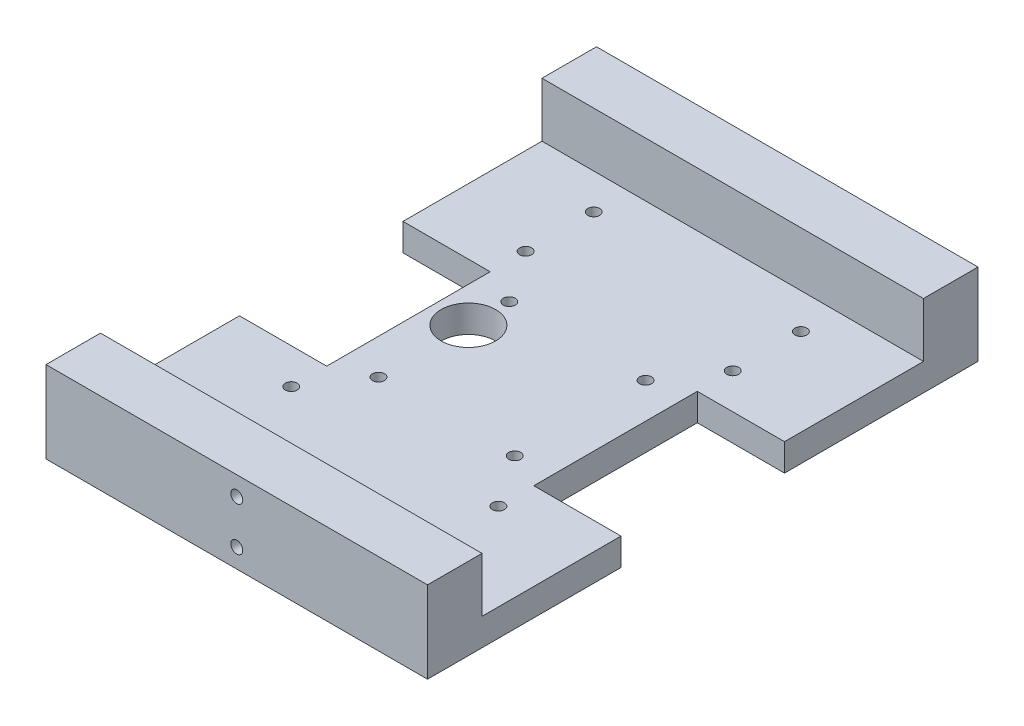
ISO-10303-21;
HEADER;
FILE_DESCRIPTION(('STEP AP214'),'2;1');
FILE_NAME('part.step','',(''),(''),'','','');
FILE_SCHEMA(('AUTOMOTIVE_DESIGN { 1 0 10303 214 1 1 1 1 }'));
ENDSEC;
DATA;
#1=APPLICATION_CONTEXT('core data for automotive mechanical design processes');
#2=APPLICATION_PROTOCOL_DEFINITION('international standard','automotive_design',2000,#1);
#3=PRODUCT_CONTEXT('',#1,'mechanical');
#4=PRODUCT('Part','Part','',(#3));
#5=PRODUCT_RELATED_PRODUCT_CATEGORY('part','',(#4));
#6=PRODUCT_DEFINITION_FORMATION('','',#4);
#7=PRODUCT_DEFINITION_CONTEXT('part definition',#1,'design');
#8=PRODUCT_DEFINITION('design','',#6,#7);
#9=PRODUCT_DEFINITION_SHAPE('','',#8);
#10=(LENGTH_UNIT() NAMED_UNIT(*) SI_UNIT(.MILLI.,.METRE.));
#11=(NAMED_UNIT(*) PLANE_ANGLE_UNIT() SI_UNIT($,.RADIAN.));
#12=(NAMED_UNIT(*) SI_UNIT($,.STERADIAN.) SOLID_ANGLE_UNIT());
#13=UNCERTAINTY_MEASURE_WITH_UNIT(LENGTH_MEASURE(1.E-05),#10,'distance_accuracy_value','');
#14=(GEOMETRIC_REPRESENTATION_CONTEXT(3) GLOBAL_UNCERTAINTY_ASSIGNED_CONTEXT((#13)) GLOBAL_UNIT_ASSIGNED_CONTEXT((#10,
#11,#12)) REPRESENTATION_CONTEXT('',''));
#15=CARTESIAN_POINT('',(0.,0.,0.));
#16=DIRECTION('',(0.,0.,1.));
#17=DIRECTION('',(1.,0.,0.));
#18=AXIS2_PLACEMENT_3D('',#15,#16,#17);
#19=CARTESIAN_POINT('',(0.,0.,0.));
#20=DIRECTION('',(0.,-1.,0.));
#21=DIRECTION('',(0.,0.,-1.));
#22=AXIS2_PLACEMENT_3D('',#19,#20,#21);
#23=PLANE('',#22);
#24=CARTESIAN_POINT('',(-19.,0.,34.));
#25=DIRECTION('',(0.,1.,0.));
#26=DIRECTION('',(0.,0.,1.));
#27=AXIS2_PLACEMENT_3D('',#24,#25,#26);
#28=CIRCLE('',#27,1.1);
#29=CARTESIAN_POINT('',(-19.,0.,35.1));
#30=VERTEX_POINT('',#29);
#31=EDGE_CURVE('E483',#30,#30,#28,.T.);
#32=ORIENTED_EDGE('',*,*,#31,.T.);
#33=EDGE_LOOP('',(#32));
#34=FACE_BOUND('',#33,.T.);
#35=CARTESIAN_POINT('',(-19.,0.,21.5));
#36=DIRECTION('',(0.,1.,0.));
#37=DIRECTION('',(0.,0.,1.));
#38=AXIS2_PLACEMENT_3D('',#35,#36,#37);
#39=CIRCLE('',#38,1.1);
#40=CARTESIAN_POINT('',(-19.,0.,22.6));
#41=VERTEX_POINT('',#40);
#42=EDGE_CURVE('E493',#41,#41,#39,.T.);
#43=ORIENTED_EDGE('',*,*,#42,.T.);
#44=EDGE_LOOP('',(#43));
#45=FACE_BOUND('',#44,.T.);
#46=CARTESIAN_POINT('',(19.,0.,21.5));
#47=DIRECTION('',(0.,1.,0.));
#48=DIRECTION('',(0.,0.,1.));
#49=AXIS2_PLACEMENT_3D('',#46,#47,#48);
#50=CIRCLE('',#49,1.1);
#51=CARTESIAN_POINT('',(19.,0.,22.6));
#52=VERTEX_POINT('',#51);
#53=EDGE_CURVE('E499',#52,#52,#50,.T.);
#54=ORIENTED_EDGE('',*,*,#53,.T.);
#55=EDGE_LOOP('',(#54));
#56=FACE_BOUND('',#55,.T.);
#57=CARTESIAN_POINT('',(19.,0.,-34.));
#58=DIRECTION('',(0.,1.,0.));
#59=DIRECTION('',(0.,0.,1.));
#60=AXIS2_PLACEMENT_3D('',#57,#58,#59);
#61=CIRCLE('',#60,1.1);
#62=CARTESIAN_POINT('',(19.,0.,-32.9));
#63=VERTEX_POINT('',#62);
#64=EDGE_CURVE('E529',#63,#63,#61,.T.);
#65=ORIENTED_EDGE('',*,*,#64,.T.);
#66=EDGE_LOOP('',(#65));
#67=FACE_BOUND('',#66,.T.);
#68=CARTESIAN_POINT('',(-12.5,0.,-4.5));
#69=DIRECTION('',(0.,-1.,0.));
#70=DIRECTION('',(0.,0.,-1.));
#71=AXIS2_PLACEMENT_3D('',#68,#69,#70);
#72=CIRCLE('',#71,5.);
#73=CARTESIAN_POINT('',(-12.5,0.,-9.5));
#74=VERTEX_POINT('',#73);
#75=EDGE_CURVE('E532',#74,#74,#72,.T.);
#76=ORIENTED_EDGE('',*,*,#75,.F.);
#77=EDGE_LOOP('',(#76));
#78=FACE_BOUND('',#77,.T.);
#79=CARTESIAN_POINT('',(12.5,0.,12.));
#80=DIRECTION('',(0.,-1.,0.));
#81=DIRECTION('',(0.,0.,-1.));
#82=AXIS2_PLACEMENT_3D('',#79,#80,#81);
#83=CIRCLE('',#82,1.1);
#84=CARTESIAN_POINT('',(12.5,0.,10.9));
#85=VERTEX_POINT('',#84);
#86=EDGE_CURVE('E535',#85,#85,#83,.T.);
#87=ORIENTED_EDGE('',*,*,#86,.F.);
#88=EDGE_LOOP('',(#87));
#89=FACE_BOUND('',#88,.T.);
#90=CARTESIAN_POINT('',(-12.5,0.,12.));
#91=DIRECTION('',(0.,-1.,0.));
#92=DIRECTION('',(0.,0.,-1.));
#93=AXIS2_PLACEMENT_3D('',#90,#91,#92);
#94=CIRCLE('',#93,1.1);
#95=CARTESIAN_POINT('',(-12.5,0.,10.9));
#96=VERTEX_POINT('',#95);
#97=EDGE_CURVE('E541',#96,#96,#94,.T.);
#98=ORIENTED_EDGE('',*,*,#97,.F.);
#99=EDGE_LOOP('',(#98));
#100=FACE_BOUND('',#99,.T.);
#101=CARTESIAN_POINT('',(12.5,0.,-12.));
#102=DIRECTION('',(0.,-1.,0.));
#103=DIRECTION('',(0.,0.,-1.));
#104=AXIS2_PLACEMENT_3D('',#101,#102,#103);
#105=CIRCLE('',#104,1.1);
#106=CARTESIAN_POINT('',(12.5,0.,-13.1));
#107=VERTEX_POINT('',#106);
#108=EDGE_CURVE('E547',#107,#107,#105,.T.);
#109=ORIENTED_EDGE('',*,*,#108,.F.);
#110=EDGE_LOOP('',(#109));
#111=FACE_BOUND('',#110,.T.);
#112=CARTESIAN_POINT('',(-12.5,0.,-12.));
#113=DIRECTION('',(0.,-1.,0.));
#114=DIRECTION('',(0.,0.,-1.));
#115=AXIS2_PLACEMENT_3D('',#112,#113,#114);
#116=CIRCLE('',#115,1.1);
#117=CARTESIAN_POINT('',(-12.5,0.,-13.1));
#118=VERTEX_POINT('',#117);
#119=EDGE_CURVE('E553',#118,#118,#116,.T.);
#120=ORIENTED_EDGE('',*,*,#119,.F.);
#121=EDGE_LOOP('',(#120));
#122=FACE_BOUND('',#121,.T.);
#123=DIRECTION('',(0.,0.,1.));
#124=VECTOR('',#123,1.);
#125=CARTESIAN_POINT('',(-19.,0.,-15.));
#126=LINE('',#125,#124);
#127=CARTESIAN_POINT('',(-19.,0.,-15.));
#128=VERTEX_POINT('',#127);
#129=CARTESIAN_POINT('',(-19.,0.,15.));
#130=VERTEX_POINT('',#129);
#131=EDGE_CURVE('E170',#128,#130,#126,.T.);
#132=ORIENTED_EDGE('',*,*,#131,.F.);
#133=DIRECTION('',(1.,0.,0.));
#134=VECTOR('',#133,1.);
#135=CARTESIAN_POINT('',(-35.,0.,-15.));
#136=LINE('',#135,#134);
#137=CARTESIAN_POINT('',(-35.,0.,-15.));
#138=VERTEX_POINT('',#137);
#139=EDGE_CURVE('E181',#138,#128,#136,.T.);
#140=ORIENTED_EDGE('',*,*,#139,.F.);
#141=DIRECTION('',(0.,0.,1.));
#142=VECTOR('',#141,1.);
#143=CARTESIAN_POINT('',(-35.,0.,50.5));
#144=LINE('',#143,#142);
#145=CARTESIAN_POINT('',(-35.,0.,-50.5));
#146=VERTEX_POINT('',#145);
#147=EDGE_CURVE('E187',#146,#138,#144,.T.);
#148=ORIENTED_EDGE('',*,*,#147,.F.);
#149=DIRECTION('',(-1.,0.,0.));
#150=VECTOR('',#149,1.);
#151=CARTESIAN_POINT('',(-35.,0.,-50.5));
#152=LINE('',#151,#150);
#153=CARTESIAN_POINT('',(35.,0.,-50.5));
#154=VERTEX_POINT('',#153);
#155=EDGE_CURVE('E188',#154,#146,#152,.T.);
#156=ORIENTED_EDGE('',*,*,#155,.F.);
#157=DIRECTION('',(0.,0.,-1.));
#158=VECTOR('',#157,1.);
#159=CARTESIAN_POINT('',(35.,0.,50.5));
#160=LINE('',#159,#158);
#161=CARTESIAN_POINT('',(35.,0.,-15.));
#162=VERTEX_POINT('',#161);
#163=EDGE_CURVE('E304',#162,#154,#160,.T.);
#164=ORIENTED_EDGE('',*,*,#163,.F.);
#165=DIRECTION('',(-1.,0.,0.));
#166=VECTOR('',#165,1.);
#167=CARTESIAN_POINT('',(35.,0.,-15.));
#168=LINE('',#167,#166);
#169=CARTESIAN_POINT('',(19.,0.,-15.));
#170=VERTEX_POINT('',#169);
#171=EDGE_CURVE('E237',#162,#170,#168,.T.);
#172=ORIENTED_EDGE('',*,*,#171,.T.);
#173=DIRECTION('',(0.,0.,1.));
#174=VECTOR('',#173,1.);
#175=CARTESIAN_POINT('',(19.,0.,-15.));
#176=LINE('',#175,#174);
#177=CARTESIAN_POINT('',(19.,0.,15.));
#178=VERTEX_POINT('',#177);
#179=EDGE_CURVE('E240',#170,#178,#176,.T.);
#180=ORIENTED_EDGE('',*,*,#179,.T.);
#181=DIRECTION('',(1.,0.,0.));
#182=VECTOR('',#181,1.);
#183=CARTESIAN_POINT('',(35.,0.,15.));
#184=LINE('',#183,#182);
#185=CARTESIAN_POINT('',(35.,0.,15.));
#186=VERTEX_POINT('',#185);
#187=EDGE_CURVE('E244',#178,#186,#184,.T.);
#188=ORIENTED_EDGE('',*,*,#187,.T.);
#189=CARTESIAN_POINT('',(35.,0.,50.5));
#190=VERTEX_POINT('',#189);
#191=EDGE_CURVE('E191',#190,#186,#160,.T.);
#192=ORIENTED_EDGE('',*,*,#191,.F.);
#193=DIRECTION('',(1.,0.,0.));
#194=VECTOR('',#193,1.);
#195=CARTESIAN_POINT('',(-35.,0.,50.5));
#196=LINE('',#195,#194);
#197=CARTESIAN_POINT('',(-35.,0.,50.5));
#198=VERTEX_POINT('',#197);
#199=EDGE_CURVE('E186',#198,#190,#196,.T.);
#200=ORIENTED_EDGE('',*,*,#199,.F.);
#201=CARTESIAN_POINT('',(-35.,0.,15.));
#202=VERTEX_POINT('',#201);
#203=EDGE_CURVE('E177',#202,#198,#144,.T.);
#204=ORIENTED_EDGE('',*,*,#203,.F.);
#205=DIRECTION('',(-1.,0.,0.));
#206=VECTOR('',#205,1.);
#207=CARTESIAN_POINT('',(-35.,0.,15.));
#208=LINE('',#207,#206);
#209=EDGE_CURVE('E164',#130,#202,#208,.T.);
#210=ORIENTED_EDGE('',*,*,#209,.F.);
#211=EDGE_LOOP('',(#132,#140,#148,#156,#164,#172,#180,#188,#192,#200,#204,#210));
#212=FACE_BOUND('',#211,.T.);
#213=CARTESIAN_POINT('',(19.,0.,-21.5));
#214=DIRECTION('',(0.,1.,0.));
#215=DIRECTION('',(0.,0.,1.));
#216=AXIS2_PLACEMENT_3D('',#213,#214,#215);
#217=CIRCLE('',#216,1.1);
#218=CARTESIAN_POINT('',(19.,0.,-20.4));
#219=VERTEX_POINT('',#218);
#220=EDGE_CURVE('E523',#219,#219,#217,.T.);
#221=ORIENTED_EDGE('',*,*,#220,.T.);
#222=EDGE_LOOP('',(#221));
#223=FACE_BOUND('',#222,.T.);
#224=CARTESIAN_POINT('',(-19.,0.,-21.5));
#225=DIRECTION('',(0.,1.,0.));
#226=DIRECTION('',(0.,0.,1.));
#227=AXIS2_PLACEMENT_3D('',#224,#225,#226);
#228=CIRCLE('',#227,1.1);
#229=CARTESIAN_POINT('',(-19.,0.,-20.4));
#230=VERTEX_POINT('',#229);
#231=EDGE_CURVE('E517',#230,#230,#228,.T.);
#232=ORIENTED_EDGE('',*,*,#231,.T.);
#233=EDGE_LOOP('',(#232));
#234=FACE_BOUND('',#233,.T.);
#235=CARTESIAN_POINT('',(-19.,0.,-34.));
#236=DIRECTION('',(0.,1.,0.));
#237=DIRECTION('',(0.,0.,1.));
#238=AXIS2_PLACEMENT_3D('',#235,#236,#237);
#239=CIRCLE('',#238,1.1);
#240=CARTESIAN_POINT('',(-19.,0.,-32.9));
#241=VERTEX_POINT('',#240);
#242=EDGE_CURVE('E511',#241,#241,#239,.T.);
#243=ORIENTED_EDGE('',*,*,#242,.T.);
#244=EDGE_LOOP('',(#243));
#245=FACE_BOUND('',#244,.T.);
#246=CARTESIAN_POINT('',(19.,0.,34.));
#247=DIRECTION('',(0.,1.,0.));
#248=DIRECTION('',(0.,0.,1.));
#249=AXIS2_PLACEMENT_3D('',#246,#247,#248);
#250=CIRCLE('',#249,1.1);
#251=CARTESIAN_POINT('',(19.,0.,35.1));
#252=VERTEX_POINT('',#251);
#253=EDGE_CURVE('E505',#252,#252,#250,.T.);
#254=ORIENTED_EDGE('',*,*,#253,.T.);
#255=EDGE_LOOP('',(#254));
#256=FACE_BOUND('',#255,.T.);
#257=ADVANCED_FACE('F37',(#34,#45,#56,#67,#78,#89,#100,#111,#122,#212,#223,#234,#245,#256),#23,.T.);
#258=CARTESIAN_POINT('',(-35.,15.,50.5));
#259=DIRECTION('',(1.,0.,0.));
#260=DIRECTION('',(0.,0.,-1.));
#261=AXIS2_PLACEMENT_3D('',#258,#259,#260);
#262=PLANE('',#261);
#263=DIRECTION('',(0.,1.,0.));
#264=VECTOR('',#263,1.);
#265=CARTESIAN_POINT('',(-35.,0.,-15.));
#266=LINE('',#265,#264);
#267=CARTESIAN_POINT('',(-35.,5.,-15.));
#268=VERTEX_POINT('',#267);
#269=EDGE_CURVE('E231',#138,#268,#266,.T.);
#270=ORIENTED_EDGE('',*,*,#269,.T.);
#271=DIRECTION('',(0.,0.,1.));
#272=VECTOR('',#271,1.);
#273=CARTESIAN_POINT('',(-35.,5.,40.5));
#274=LINE('',#273,#272);
#275=CARTESIAN_POINT('',(-35.,5.,-40.5));
#276=VERTEX_POINT('',#275);
#277=EDGE_CURVE('E285',#276,#268,#274,.T.);
#278=ORIENTED_EDGE('',*,*,#277,.F.);
#279=DIRECTION('',(0.,1.,0.));
#280=VECTOR('',#279,1.);
#281=CARTESIAN_POINT('',(-35.,5.,-40.5));
#282=LINE('',#281,#280);
#283=CARTESIAN_POINT('',(-35.,15.,-40.5));
#284=VERTEX_POINT('',#283);
#285=EDGE_CURVE('E302',#276,#284,#282,.T.);
#286=ORIENTED_EDGE('',*,*,#285,.T.);
#287=DIRECTION('',(0.,0.,1.));
#288=VECTOR('',#287,1.);
#289=CARTESIAN_POINT('',(-35.,15.,50.5));
#290=LINE('',#289,#288);
#291=CARTESIAN_POINT('',(-35.,15.,-50.5));
#292=VERTEX_POINT('',#291);
#293=EDGE_CURVE('E212',#292,#284,#290,.T.);
#294=ORIENTED_EDGE('',*,*,#293,.F.);
#295=DIRECTION('',(0.,-1.,0.));
#296=VECTOR('',#295,1.);
#297=CARTESIAN_POINT('',(-35.,15.,-50.5));
#298=LINE('',#297,#296);
#299=EDGE_CURVE('E46',#292,#146,#298,.T.);
#300=ORIENTED_EDGE('',*,*,#299,.T.);
#301=ORIENTED_EDGE('',*,*,#147,.T.);
#302=EDGE_LOOP('',(#270,#278,#286,#294,#300,#301));
#303=FACE_BOUND('',#302,.T.);
#304=ADVANCED_FACE('F209',(#303),#262,.F.);
#305=DIRECTION('',(0.,1.,0.));
#306=VECTOR('',#305,1.);
#307=CARTESIAN_POINT('',(-35.,0.,15.));
#308=LINE('',#307,#306);
#309=CARTESIAN_POINT('',(-35.,5.,15.));
#310=VERTEX_POINT('',#309);
#311=EDGE_CURVE('E53',#202,#310,#308,.T.);
#312=ORIENTED_EDGE('',*,*,#311,.F.);
#313=ORIENTED_EDGE('',*,*,#203,.T.);
#314=DIRECTION('',(0.,-1.,0.));
#315=VECTOR('',#314,1.);
#316=CARTESIAN_POINT('',(-35.,15.,50.5));
#317=LINE('',#316,#315);
#318=CARTESIAN_POINT('',(-35.,15.,50.5));
#319=VERTEX_POINT('',#318);
#320=EDGE_CURVE('E200',#319,#198,#317,.T.);
#321=ORIENTED_EDGE('',*,*,#320,.F.);
#322=CARTESIAN_POINT('',(-35.,15.,40.5));
#323=VERTEX_POINT('',#322);
#324=EDGE_CURVE('E316',#323,#319,#290,.T.);
#325=ORIENTED_EDGE('',*,*,#324,.F.);
#326=DIRECTION('',(0.,1.,0.));
#327=VECTOR('',#326,1.);
#328=CARTESIAN_POINT('',(-35.,5.,40.5));
#329=LINE('',#328,#327);
#330=CARTESIAN_POINT('',(-35.,5.,40.5));
#331=VERTEX_POINT('',#330);
#332=EDGE_CURVE('E298',#331,#323,#329,.T.);
#333=ORIENTED_EDGE('',*,*,#332,.F.);
#334=EDGE_CURVE('E180',#310,#331,#274,.T.);
#335=ORIENTED_EDGE('',*,*,#334,.F.);
#336=EDGE_LOOP('',(#312,#313,#321,#325,#333,#335));
#337=FACE_BOUND('',#336,.T.);
#338=ADVANCED_FACE('F175',(#337),#262,.F.);
#339=CARTESIAN_POINT('',(0.,5.,0.));
#340=DIRECTION('',(0.,1.,0.));
#341=DIRECTION('',(0.,0.,1.));
#342=AXIS2_PLACEMENT_3D('',#339,#340,#341);
#343=PLANE('',#342);
#344=CARTESIAN_POINT('',(-19.,5.,34.));
#345=DIRECTION('',(0.,1.,0.));
#346=DIRECTION('',(0.,0.,1.));
#347=AXIS2_PLACEMENT_3D('',#344,#345,#346);
#348=CIRCLE('',#347,1.1);
#349=CARTESIAN_POINT('',(-19.,5.,35.1));
#350=VERTEX_POINT('',#349);
#351=EDGE_CURVE('E486',#350,#350,#348,.T.);
#352=ORIENTED_EDGE('',*,*,#351,.F.);
#353=EDGE_LOOP('',(#352));
#354=FACE_BOUND('',#353,.T.);
#355=CARTESIAN_POINT('',(-19.,5.,21.5));
#356=DIRECTION('',(0.,1.,0.));
#357=DIRECTION('',(0.,0.,1.));
#358=AXIS2_PLACEMENT_3D('',#355,#356,#357);
#359=CIRCLE('',#358,1.1);
#360=CARTESIAN_POINT('',(-19.,5.,22.6));
#361=VERTEX_POINT('',#360);
#362=EDGE_CURVE('E488',#361,#361,#359,.T.);
#363=ORIENTED_EDGE('',*,*,#362,.F.);
#364=EDGE_LOOP('',(#363));
#365=FACE_BOUND('',#364,.T.);
#366=CARTESIAN_POINT('',(19.,5.,21.5));
#367=DIRECTION('',(0.,1.,0.));
#368=DIRECTION('',(0.,0.,1.));
#369=AXIS2_PLACEMENT_3D('',#366,#367,#368);
#370=CIRCLE('',#369,1.1);
#371=CARTESIAN_POINT('',(19.,5.,22.6));
#372=VERTEX_POINT('',#371);
#373=EDGE_CURVE('E496',#372,#372,#370,.T.);
#374=ORIENTED_EDGE('',*,*,#373,.F.);
#375=EDGE_LOOP('',(#374));
#376=FACE_BOUND('',#375,.T.);
#377=CARTESIAN_POINT('',(19.,5.,34.));
#378=DIRECTION('',(0.,1.,0.));
#379=DIRECTION('',(0.,0.,1.));
#380=AXIS2_PLACEMENT_3D('',#377,#378,#379);
#381=CIRCLE('',#380,1.1);
#382=CARTESIAN_POINT('',(19.,5.,35.1));
#383=VERTEX_POINT('',#382);
#384=EDGE_CURVE('E502',#383,#383,#381,.T.);
#385=ORIENTED_EDGE('',*,*,#384,.F.);
#386=EDGE_LOOP('',(#385));
#387=FACE_BOUND('',#386,.T.);
#388=CARTESIAN_POINT('',(-19.,5.,-34.));
#389=DIRECTION('',(0.,1.,0.));
#390=DIRECTION('',(0.,0.,1.));
#391=AXIS2_PLACEMENT_3D('',#388,#389,#390);
#392=CIRCLE('',#391,1.1);
#393=CARTESIAN_POINT('',(-19.,5.,-32.9));
#394=VERTEX_POINT('',#393);
#395=EDGE_CURVE('E508',#394,#394,#392,.T.);
#396=ORIENTED_EDGE('',*,*,#395,.F.);
#397=EDGE_LOOP('',(#396));
#398=FACE_BOUND('',#397,.T.);
#399=CARTESIAN_POINT('',(-19.,5.,-21.5));
#400=DIRECTION('',(0.,1.,0.));
#401=DIRECTION('',(0.,0.,1.));
#402=AXIS2_PLACEMENT_3D('',#399,#400,#401);
#403=CIRCLE('',#402,1.1);
#404=CARTESIAN_POINT('',(-19.,5.,-20.4));
#405=VERTEX_POINT('',#404);
#406=EDGE_CURVE('E514',#405,#405,#403,.T.);
#407=ORIENTED_EDGE('',*,*,#406,.F.);
#408=EDGE_LOOP('',(#407));
#409=FACE_BOUND('',#408,.T.);
#410=CARTESIAN_POINT('',(19.,5.,-21.5));
#411=DIRECTION('',(0.,1.,0.));
#412=DIRECTION('',(0.,0.,1.));
#413=AXIS2_PLACEMENT_3D('',#410,#411,#412);
#414=CIRCLE('',#413,1.1);
#415=CARTESIAN_POINT('',(19.,5.,-20.4));
#416=VERTEX_POINT('',#415);
#417=EDGE_CURVE('E520',#416,#416,#414,.T.);
#418=ORIENTED_EDGE('',*,*,#417,.F.);
#419=EDGE_LOOP('',(#418));
#420=FACE_BOUND('',#419,.T.);
#421=CARTESIAN_POINT('',(19.,5.,-34.));
#422=DIRECTION('',(0.,1.,0.));
#423=DIRECTION('',(0.,0.,1.));
#424=AXIS2_PLACEMENT_3D('',#421,#422,#423);
#425=CIRCLE('',#424,1.1);
#426=CARTESIAN_POINT('',(19.,5.,-32.9));
#427=VERTEX_POINT('',#426);
#428=EDGE_CURVE('E526',#427,#427,#425,.T.);
#429=ORIENTED_EDGE('',*,*,#428,.F.);
#430=EDGE_LOOP('',(#429));
#431=FACE_BOUND('',#430,.T.);
#432=CARTESIAN_POINT('',(-12.5,5.,-4.5));
#433=DIRECTION('',(0.,1.,0.));
#434=DIRECTION('',(0.,0.,1.));
#435=AXIS2_PLACEMENT_3D('',#432,#433,#434);
#436=CIRCLE('',#435,5.);
#437=CARTESIAN_POINT('',(-12.5,5.,0.500000000000003));
#438=VERTEX_POINT('',#437);
#439=EDGE_CURVE('E41',#438,#438,#436,.T.);
#440=ORIENTED_EDGE('',*,*,#439,.F.);
#441=EDGE_LOOP('',(#440));
#442=FACE_BOUND('',#441,.T.);
#443=CARTESIAN_POINT('',(12.5,5.,12.));
#444=DIRECTION('',(0.,1.,0.));
#445=DIRECTION('',(0.,0.,1.));
#446=AXIS2_PLACEMENT_3D('',#443,#444,#445);
#447=CIRCLE('',#446,1.1);
#448=CARTESIAN_POINT('',(12.5,5.,13.1));
#449=VERTEX_POINT('',#448);
#450=EDGE_CURVE('E538',#449,#449,#447,.T.);
#451=ORIENTED_EDGE('',*,*,#450,.F.);
#452=EDGE_LOOP('',(#451));
#453=FACE_BOUND('',#452,.T.);
#454=CARTESIAN_POINT('',(-12.5,5.,12.));
#455=DIRECTION('',(0.,1.,0.));
#456=DIRECTION('',(0.,0.,1.));
#457=AXIS2_PLACEMENT_3D('',#454,#455,#456);
#458=CIRCLE('',#457,1.1);
#459=CARTESIAN_POINT('',(-12.5,5.,13.1));
#460=VERTEX_POINT('',#459);
#461=EDGE_CURVE('E544',#460,#460,#458,.T.);
#462=ORIENTED_EDGE('',*,*,#461,.F.);
#463=EDGE_LOOP('',(#462));
#464=FACE_BOUND('',#463,.T.);
#465=CARTESIAN_POINT('',(12.5,5.,-12.));
#466=DIRECTION('',(0.,1.,0.));
#467=DIRECTION('',(0.,0.,1.));
#468=AXIS2_PLACEMENT_3D('',#465,#466,#467);
#469=CIRCLE('',#468,1.1);
#470=CARTESIAN_POINT('',(12.5,5.,-10.9));
#471=VERTEX_POINT('',#470);
#472=EDGE_CURVE('E550',#471,#471,#469,.T.);
#473=ORIENTED_EDGE('',*,*,#472,.F.);
#474=EDGE_LOOP('',(#473));
#475=FACE_BOUND('',#474,.T.);
#476=CARTESIAN_POINT('',(-12.5,5.,-12.));
#477=DIRECTION('',(0.,1.,0.));
#478=DIRECTION('',(0.,0.,1.));
#479=AXIS2_PLACEMENT_3D('',#476,#477,#478);
#480=CIRCLE('',#479,1.1);
#481=CARTESIAN_POINT('',(-12.5,5.,-10.9));
#482=VERTEX_POINT('',#481);
#483=EDGE_CURVE('E226',#482,#482,#480,.T.);
#484=ORIENTED_EDGE('',*,*,#483,.F.);
#485=EDGE_LOOP('',(#484));
#486=FACE_BOUND('',#485,.T.);
#487=ORIENTED_EDGE('',*,*,#277,.T.);
#488=DIRECTION('',(1.,0.,0.));
#489=VECTOR('',#488,1.);
#490=CARTESIAN_POINT('',(-35.,5.,-15.));
#491=LINE('',#490,#489);
#492=CARTESIAN_POINT('',(-19.,5.,-15.));
#493=VERTEX_POINT('',#492);
#494=EDGE_CURVE('E171',#268,#493,#491,.T.);
#495=ORIENTED_EDGE('',*,*,#494,.T.);
#496=DIRECTION('',(0.,0.,1.));
#497=VECTOR('',#496,1.);
#498=CARTESIAN_POINT('',(-19.,5.,-15.));
#499=LINE('',#498,#497);
#500=CARTESIAN_POINT('',(-19.,5.,15.));
#501=VERTEX_POINT('',#500);
#502=EDGE_CURVE('E225',#493,#501,#499,.T.);
#503=ORIENTED_EDGE('',*,*,#502,.T.);
#504=DIRECTION('',(-1.,0.,0.));
#505=VECTOR('',#504,1.);
#506=CARTESIAN_POINT('',(-35.,5.,15.));
#507=LINE('',#506,#505);
#508=EDGE_CURVE('E223',#501,#310,#507,.T.);
#509=ORIENTED_EDGE('',*,*,#508,.T.);
#510=ORIENTED_EDGE('',*,*,#334,.T.);
#511=DIRECTION('',(1.,0.,0.));
#512=VECTOR('',#511,1.);
#513=CARTESIAN_POINT('',(35.,5.,40.5));
#514=LINE('',#513,#512);
#515=CARTESIAN_POINT('',(35.,5.,40.5));
#516=VERTEX_POINT('',#515);
#517=EDGE_CURVE('E288',#331,#516,#514,.T.);
#518=ORIENTED_EDGE('',*,*,#517,.T.);
#519=DIRECTION('',(0.,0.,-1.));
#520=VECTOR('',#519,1.);
#521=CARTESIAN_POINT('',(35.,5.,40.5));
#522=LINE('',#521,#520);
#523=CARTESIAN_POINT('',(35.,5.,15.));
#524=VERTEX_POINT('',#523);
#525=EDGE_CURVE('E292',#516,#524,#522,.T.);
#526=ORIENTED_EDGE('',*,*,#525,.T.);
#527=DIRECTION('',(1.,0.,0.));
#528=VECTOR('',#527,1.);
#529=CARTESIAN_POINT('',(35.,5.,15.));
#530=LINE('',#529,#528);
#531=CARTESIAN_POINT('',(19.,5.,15.));
#532=VERTEX_POINT('',#531);
#533=EDGE_CURVE('E241',#532,#524,#530,.T.);
#534=ORIENTED_EDGE('',*,*,#533,.F.);
#535=DIRECTION('',(0.,0.,1.));
#536=VECTOR('',#535,1.);
#537=CARTESIAN_POINT('',(19.,5.,-15.));
#538=LINE('',#537,#536);
#539=CARTESIAN_POINT('',(19.,5.,-15.));
#540=VERTEX_POINT('',#539);
#541=EDGE_CURVE('E248',#540,#532,#538,.T.);
#542=ORIENTED_EDGE('',*,*,#541,.F.);
#543=DIRECTION('',(-1.,0.,0.));
#544=VECTOR('',#543,1.);
#545=CARTESIAN_POINT('',(35.,5.,-15.));
#546=LINE('',#545,#544);
#547=CARTESIAN_POINT('',(35.,5.,-15.));
#548=VERTEX_POINT('',#547);
#549=EDGE_CURVE('E233',#548,#540,#546,.T.);
#550=ORIENTED_EDGE('',*,*,#549,.F.);
#551=CARTESIAN_POINT('',(35.,5.,-40.5));
#552=VERTEX_POINT('',#551);
#553=EDGE_CURVE('E291',#548,#552,#522,.T.);
#554=ORIENTED_EDGE('',*,*,#553,.T.);
#555=DIRECTION('',(-1.,0.,0.));
#556=VECTOR('',#555,1.);
#557=CARTESIAN_POINT('',(35.,5.,-40.5));
#558=LINE('',#557,#556);
#559=EDGE_CURVE('E295',#552,#276,#558,.T.);
#560=ORIENTED_EDGE('',*,*,#559,.T.);
#561=EDGE_LOOP('',(#487,#495,#503,#509,#510,#518,#526,#534,#542,#550,#554,#560));
#562=FACE_BOUND('',#561,.T.);
#563=ADVANCED_FACE('F336',(#354,#365,#376,#387,#398,#409,#420,#431,#442,#453,#464,#475,#486,
#562),#343,.T.);
#564=CARTESIAN_POINT('',(35.,15.,50.5));
#565=DIRECTION('',(-1.,0.,0.));
#566=DIRECTION('',(0.,0.,1.));
#567=AXIS2_PLACEMENT_3D('',#564,#565,#566);
#568=PLANE('',#567);
#569=ORIENTED_EDGE('',*,*,#191,.T.);
#570=DIRECTION('',(0.,1.,0.));
#571=VECTOR('',#570,1.);
#572=CARTESIAN_POINT('',(35.,0.,15.));
#573=LINE('',#572,#571);
#574=EDGE_CURVE('E252',#186,#524,#573,.T.);
#575=ORIENTED_EDGE('',*,*,#574,.T.);
#576=ORIENTED_EDGE('',*,*,#525,.F.);
#577=DIRECTION('',(0.,1.,0.));
#578=VECTOR('',#577,1.);
#579=CARTESIAN_POINT('',(35.,5.,40.5));
#580=LINE('',#579,#578);
#581=CARTESIAN_POINT('',(35.,15.,40.5));
#582=VERTEX_POINT('',#581);
#583=EDGE_CURVE('E307',#516,#582,#580,.T.);
#584=ORIENTED_EDGE('',*,*,#583,.T.);
#585=DIRECTION('',(0.,0.,-1.));
#586=VECTOR('',#585,1.);
#587=CARTESIAN_POINT('',(35.,15.,50.5));
#588=LINE('',#587,#586);
#589=CARTESIAN_POINT('',(35.,15.,50.5));
#590=VERTEX_POINT('',#589);
#591=EDGE_CURVE('E311',#590,#582,#588,.T.);
#592=ORIENTED_EDGE('',*,*,#591,.F.);
#593=DIRECTION('',(0.,-1.,0.));
#594=VECTOR('',#593,1.);
#595=CARTESIAN_POINT('',(35.,15.,50.5));
#596=LINE('',#595,#594);
#597=EDGE_CURVE('E197',#590,#190,#596,.T.);
#598=ORIENTED_EDGE('',*,*,#597,.T.);
#599=EDGE_LOOP('',(#569,#575,#576,#584,#592,#598));
#600=FACE_BOUND('',#599,.T.);
#601=ADVANCED_FACE('F334',(#600),#568,.F.);
#602=CARTESIAN_POINT('',(0.,15.,0.));
#603=DIRECTION('',(0.,-1.,0.));
#604=DIRECTION('',(0.,0.,-1.));
#605=AXIS2_PLACEMENT_3D('',#602,#603,#604);
#606=PLANE('',#605);
#607=ORIENTED_EDGE('',*,*,#293,.T.);
#608=DIRECTION('',(-1.,0.,0.));
#609=VECTOR('',#608,1.);
#610=CARTESIAN_POINT('',(35.,15.,-40.5));
#611=LINE('',#610,#609);
#612=CARTESIAN_POINT('',(35.,15.,-40.5));
#613=VERTEX_POINT('',#612);
#614=EDGE_CURVE('E300',#613,#284,#611,.T.);
#615=ORIENTED_EDGE('',*,*,#614,.F.);
#616=CARTESIAN_POINT('',(35.,15.,-50.5));
#617=VERTEX_POINT('',#616);
#618=EDGE_CURVE('E196',#613,#617,#588,.T.);
#619=ORIENTED_EDGE('',*,*,#618,.T.);
#620=DIRECTION('',(-1.,0.,0.));
#621=VECTOR('',#620,1.);
#622=CARTESIAN_POINT('',(-35.,15.,-50.5));
#623=LINE('',#622,#621);
#624=EDGE_CURVE('E314',#617,#292,#623,.T.);
#625=ORIENTED_EDGE('',*,*,#624,.T.);
#626=EDGE_LOOP('',(#607,#615,#619,#625));
#627=FACE_BOUND('',#626,.T.);
#628=ADVANCED_FACE('F359',(#627),#606,.F.);
#629=ORIENTED_EDGE('',*,*,#553,.F.);
#630=DIRECTION('',(0.,1.,0.));
#631=VECTOR('',#630,1.);
#632=CARTESIAN_POINT('',(35.,0.,-15.));
#633=LINE('',#632,#631);
#634=EDGE_CURVE('E61',#162,#548,#633,.T.);
#635=ORIENTED_EDGE('',*,*,#634,.F.);
#636=ORIENTED_EDGE('',*,*,#163,.T.);
#637=DIRECTION('',(0.,-1.,0.));
#638=VECTOR('',#637,1.);
#639=CARTESIAN_POINT('',(35.,15.,-50.5));
#640=LINE('',#639,#638);
#641=EDGE_CURVE('E11',#617,#154,#640,.T.);
#642=ORIENTED_EDGE('',*,*,#641,.F.);
#643=ORIENTED_EDGE('',*,*,#618,.F.);
#644=DIRECTION('',(0.,1.,0.));
#645=VECTOR('',#644,1.);
#646=CARTESIAN_POINT('',(35.,5.,-40.5));
#647=LINE('',#646,#645);
#648=EDGE_CURVE('E305',#552,#613,#647,.T.);
#649=ORIENTED_EDGE('',*,*,#648,.F.);
#650=EDGE_LOOP('',(#629,#635,#636,#642,#643,#649));
#651=FACE_BOUND('',#650,.T.);
#652=ADVANCED_FACE('F39',(#651),#568,.F.);
#653=CARTESIAN_POINT('',(-35.,15.,-50.5));
#654=DIRECTION('',(0.,0.,1.));
#655=DIRECTION('',(1.,0.,0.));
#656=AXIS2_PLACEMENT_3D('',#653,#654,#655);
#657=PLANE('',#656);
#658=CARTESIAN_POINT('',(0.,3.5,-50.5));
#659=DIRECTION('',(0.,0.,-1.));
#660=DIRECTION('',(-1.,0.,0.));
#661=AXIS2_PLACEMENT_3D('',#658,#659,#660);
#662=CIRCLE('',#661,1.1);
#663=CARTESIAN_POINT('',(-1.1,3.5,-50.5));
#664=VERTEX_POINT('',#663);
#665=EDGE_CURVE('E272',#664,#664,#662,.T.);
#666=ORIENTED_EDGE('',*,*,#665,.F.);
#667=EDGE_LOOP('',(#666));
#668=FACE_BOUND('',#667,.T.);
#669=CARTESIAN_POINT('',(0.,11.5,-50.5));
#670=DIRECTION('',(0.,0.,-1.));
#671=DIRECTION('',(-1.,0.,0.));
#672=AXIS2_PLACEMENT_3D('',#669,#670,#671);
#673=CIRCLE('',#672,1.1);
#674=CARTESIAN_POINT('',(-1.1,11.5,-50.5));
#675=VERTEX_POINT('',#674);
#676=EDGE_CURVE('E278',#675,#675,#673,.T.);
#677=ORIENTED_EDGE('',*,*,#676,.F.);
#678=EDGE_LOOP('',(#677));
#679=FACE_BOUND('',#678,.T.);
#680=ORIENTED_EDGE('',*,*,#155,.T.);
#681=ORIENTED_EDGE('',*,*,#299,.F.);
#682=ORIENTED_EDGE('',*,*,#624,.F.);
#683=ORIENTED_EDGE('',*,*,#641,.T.);
#684=EDGE_LOOP('',(#680,#681,#682,#683));
#685=FACE_BOUND('',#684,.T.);
#686=ADVANCED_FACE('F350',(#668,#679,#685),#657,.F.);
#687=CARTESIAN_POINT('',(-35.,15.,50.5));
#688=DIRECTION('',(0.,0.,-1.));
#689=DIRECTION('',(-1.,0.,0.));
#690=AXIS2_PLACEMENT_3D('',#687,#688,#689);
#691=PLANE('',#690);
#692=CARTESIAN_POINT('',(0.,3.5,50.5));
#693=DIRECTION('',(0.,0.,1.));
#694=DIRECTION('',(1.,0.,0.));
#695=AXIS2_PLACEMENT_3D('',#692,#693,#694);
#696=CIRCLE('',#695,1.1);
#697=CARTESIAN_POINT('',(1.1,3.5,50.5));
#698=VERTEX_POINT('',#697);
#699=EDGE_CURVE('E255',#698,#698,#696,.T.);
#700=ORIENTED_EDGE('',*,*,#699,.F.);
#701=EDGE_LOOP('',(#700));
#702=FACE_BOUND('',#701,.T.);
#703=CARTESIAN_POINT('',(0.,11.5,50.5));
#704=DIRECTION('',(0.,0.,1.));
#705=DIRECTION('',(1.,0.,0.));
#706=AXIS2_PLACEMENT_3D('',#703,#704,#705);
#707=CIRCLE('',#706,1.1);
#708=CARTESIAN_POINT('',(1.1,11.5,50.5));
#709=VERTEX_POINT('',#708);
#710=EDGE_CURVE('E266',#709,#709,#707,.T.);
#711=ORIENTED_EDGE('',*,*,#710,.F.);
#712=EDGE_LOOP('',(#711));
#713=FACE_BOUND('',#712,.T.);
#714=ORIENTED_EDGE('',*,*,#199,.T.);
#715=ORIENTED_EDGE('',*,*,#597,.F.);
#716=DIRECTION('',(1.,0.,0.));
#717=VECTOR('',#716,1.);
#718=CARTESIAN_POINT('',(-35.,15.,50.5));
#719=LINE('',#718,#717);
#720=EDGE_CURVE('E201',#319,#590,#719,.T.);
#721=ORIENTED_EDGE('',*,*,#720,.F.);
#722=ORIENTED_EDGE('',*,*,#320,.T.);
#723=EDGE_LOOP('',(#714,#715,#721,#722));
#724=FACE_BOUND('',#723,.T.);
#725=ADVANCED_FACE('F348',(#702,#713,#724),#691,.F.);
#726=ORIENTED_EDGE('',*,*,#591,.T.);
#727=DIRECTION('',(1.,0.,0.));
#728=VECTOR('',#727,1.);
#729=CARTESIAN_POINT('',(35.,15.,40.5));
#730=LINE('',#729,#728);
#731=EDGE_CURVE('E284',#323,#582,#730,.T.);
#732=ORIENTED_EDGE('',*,*,#731,.F.);
#733=ORIENTED_EDGE('',*,*,#324,.T.);
#734=ORIENTED_EDGE('',*,*,#720,.T.);
#735=EDGE_LOOP('',(#726,#732,#733,#734));
#736=FACE_BOUND('',#735,.T.);
#737=ADVANCED_FACE('F344',(#736),#606,.F.);
#738=CARTESIAN_POINT('',(35.,5.,-40.5));
#739=DIRECTION('',(0.,0.,-1.));
#740=DIRECTION('',(-1.,0.,0.));
#741=AXIS2_PLACEMENT_3D('',#738,#739,#740);
#742=PLANE('',#741);
#743=ORIENTED_EDGE('',*,*,#614,.T.);
#744=ORIENTED_EDGE('',*,*,#285,.F.);
#745=ORIENTED_EDGE('',*,*,#559,.F.);
#746=ORIENTED_EDGE('',*,*,#648,.T.);
#747=EDGE_LOOP('',(#743,#744,#745,#746));
#748=FACE_BOUND('',#747,.T.);
#749=ADVANCED_FACE('F357',(#748),#742,.F.);
#750=CARTESIAN_POINT('',(35.,5.,40.5));
#751=DIRECTION('',(0.,0.,1.));
#752=DIRECTION('',(1.,0.,0.));
#753=AXIS2_PLACEMENT_3D('',#750,#751,#752);
#754=PLANE('',#753);
#755=ORIENTED_EDGE('',*,*,#731,.T.);
#756=ORIENTED_EDGE('',*,*,#583,.F.);
#757=ORIENTED_EDGE('',*,*,#517,.F.);
#758=ORIENTED_EDGE('',*,*,#332,.T.);
#759=EDGE_LOOP('',(#755,#756,#757,#758));
#760=FACE_BOUND('',#759,.T.);
#761=ADVANCED_FACE('F339',(#760),#754,.F.);
#762=CARTESIAN_POINT('',(0.,11.5,-44.15));
#763=DIRECTION('',(0.,0.,-1.));
#764=DIRECTION('',(-1.,0.,0.));
#765=AXIS2_PLACEMENT_3D('',#762,#763,#764);
#766=CONICAL_SURFACE('',#765,1.1,1.02974425867665);
#767=CARTESIAN_POINT('',(0.,11.5,-43.4890533190697));
#768=VERTEX_POINT('',#767);
#769=VERTEX_LOOP('',#768);
#770=FACE_BOUND('',#769,.T.);
#771=CARTESIAN_POINT('',(0.,11.5,-44.15));
#772=DIRECTION('',(0.,0.,-1.));
#773=DIRECTION('',(-1.,0.,0.));
#774=AXIS2_PLACEMENT_3D('',#771,#772,#773);
#775=CIRCLE('',#774,1.1);
#776=CARTESIAN_POINT('',(-1.1,11.5,-44.15));
#777=VERTEX_POINT('',#776);
#778=EDGE_CURVE('E281',#777,#777,#775,.T.);
#779=ORIENTED_EDGE('',*,*,#778,.T.);
#780=EDGE_LOOP('',(#779));
#781=FACE_BOUND('',#780,.T.);
#782=ADVANCED_FACE('F375',(#770,#781),#766,.F.);
#783=CARTESIAN_POINT('',(0.,11.5,-50.5));
#784=DIRECTION('',(0.,0.,-1.));
#785=DIRECTION('',(-1.,0.,0.));
#786=AXIS2_PLACEMENT_3D('',#783,#784,#785);
#787=CYLINDRICAL_SURFACE('',#786,1.1);
#788=ORIENTED_EDGE('',*,*,#778,.F.);
#789=EDGE_LOOP('',(#788));
#790=FACE_BOUND('',#789,.T.);
#791=ORIENTED_EDGE('',*,*,#676,.T.);
#792=EDGE_LOOP('',(#791));
#793=FACE_BOUND('',#792,.T.);
#794=ADVANCED_FACE('F384',(#790,#793),#787,.F.);
#795=CARTESIAN_POINT('',(0.,3.5,-44.15));
#796=DIRECTION('',(0.,0.,-1.));
#797=DIRECTION('',(-1.,0.,0.));
#798=AXIS2_PLACEMENT_3D('',#795,#796,#797);
#799=CONICAL_SURFACE('',#798,1.1,1.02974425867665);
#800=CARTESIAN_POINT('',(0.,3.5,-43.4890533190697));
#801=VERTEX_POINT('',#800);
#802=VERTEX_LOOP('',#801);
#803=FACE_BOUND('',#802,.T.);
#804=CARTESIAN_POINT('',(0.,3.5,-44.15));
#805=DIRECTION('',(0.,0.,-1.));
#806=DIRECTION('',(-1.,0.,0.));
#807=AXIS2_PLACEMENT_3D('',#804,#805,#806);
#808=CIRCLE('',#807,1.1);
#809=CARTESIAN_POINT('',(-1.1,3.5,-44.15));
#810=VERTEX_POINT('',#809);
#811=EDGE_CURVE('E275',#810,#810,#808,.T.);
#812=ORIENTED_EDGE('',*,*,#811,.T.);
#813=EDGE_LOOP('',(#812));
#814=FACE_BOUND('',#813,.T.);
#815=ADVANCED_FACE('F388',(#803,#814),#799,.F.);
#816=CARTESIAN_POINT('',(0.,3.5,-50.5));
#817=DIRECTION('',(0.,0.,-1.));
#818=DIRECTION('',(-1.,0.,0.));
#819=AXIS2_PLACEMENT_3D('',#816,#817,#818);
#820=CYLINDRICAL_SURFACE('',#819,1.1);
#821=ORIENTED_EDGE('',*,*,#811,.F.);
#822=EDGE_LOOP('',(#821));
#823=FACE_BOUND('',#822,.T.);
#824=ORIENTED_EDGE('',*,*,#665,.T.);
#825=EDGE_LOOP('',(#824));
#826=FACE_BOUND('',#825,.T.);
#827=ADVANCED_FACE('F392',(#823,#826),#820,.F.);
#828=CARTESIAN_POINT('',(0.,11.5,44.15));
#829=DIRECTION('',(0.,0.,1.));
#830=DIRECTION('',(1.,0.,0.));
#831=AXIS2_PLACEMENT_3D('',#828,#829,#830);
#832=CONICAL_SURFACE('',#831,1.1,1.02974425867665);
#833=CARTESIAN_POINT('',(0.,11.5,43.4890533190697));
#834=VERTEX_POINT('',#833);
#835=VERTEX_LOOP('',#834);
#836=FACE_BOUND('',#835,.T.);
#837=CARTESIAN_POINT('',(0.,11.5,44.15));
#838=DIRECTION('',(0.,0.,1.));
#839=DIRECTION('',(1.,0.,0.));
#840=AXIS2_PLACEMENT_3D('',#837,#838,#839);
#841=CIRCLE('',#840,1.1);
#842=CARTESIAN_POINT('',(1.1,11.5,44.15));
#843=VERTEX_POINT('',#842);
#844=EDGE_CURVE('E269',#843,#843,#841,.T.);
#845=ORIENTED_EDGE('',*,*,#844,.T.);
#846=EDGE_LOOP('',(#845));
#847=FACE_BOUND('',#846,.T.);
#848=ADVANCED_FACE('F396',(#836,#847),#832,.F.);
#849=CARTESIAN_POINT('',(0.,11.5,50.5));
#850=DIRECTION('',(0.,0.,1.));
#851=DIRECTION('',(1.,0.,0.));
#852=AXIS2_PLACEMENT_3D('',#849,#850,#851);
#853=CYLINDRICAL_SURFACE('',#852,1.1);
#854=ORIENTED_EDGE('',*,*,#844,.F.);
#855=EDGE_LOOP('',(#854));
#856=FACE_BOUND('',#855,.T.);
#857=ORIENTED_EDGE('',*,*,#710,.T.);
#858=EDGE_LOOP('',(#857));
#859=FACE_BOUND('',#858,.T.);
#860=ADVANCED_FACE('F400',(#856,#859),#853,.F.);
#861=CARTESIAN_POINT('',(0.,3.5,44.15));
#862=DIRECTION('',(0.,0.,1.));
#863=DIRECTION('',(1.,0.,0.));
#864=AXIS2_PLACEMENT_3D('',#861,#862,#863);
#865=CONICAL_SURFACE('',#864,1.1,1.02974425867665);
#866=CARTESIAN_POINT('',(0.,3.5,43.4890533190697));
#867=VERTEX_POINT('',#866);
#868=VERTEX_LOOP('',#867);
#869=FACE_BOUND('',#868,.T.);
#870=CARTESIAN_POINT('',(0.,3.5,44.15));
#871=DIRECTION('',(0.,0.,1.));
#872=DIRECTION('',(1.,0.,0.));
#873=AXIS2_PLACEMENT_3D('',#870,#871,#872);
#874=CIRCLE('',#873,1.1);
#875=CARTESIAN_POINT('',(1.1,3.5,44.15));
#876=VERTEX_POINT('',#875);
#877=EDGE_CURVE('E263',#876,#876,#874,.T.);
#878=ORIENTED_EDGE('',*,*,#877,.T.);
#879=EDGE_LOOP('',(#878));
#880=FACE_BOUND('',#879,.T.);
#881=ADVANCED_FACE('F404',(#869,#880),#865,.F.);
#882=CARTESIAN_POINT('',(0.,3.5,50.5));
#883=DIRECTION('',(0.,0.,1.));
#884=DIRECTION('',(1.,0.,0.));
#885=AXIS2_PLACEMENT_3D('',#882,#883,#884);
#886=CYLINDRICAL_SURFACE('',#885,1.1);
#887=ORIENTED_EDGE('',*,*,#877,.F.);
#888=EDGE_LOOP('',(#887));
#889=FACE_BOUND('',#888,.T.);
#890=ORIENTED_EDGE('',*,*,#699,.T.);
#891=EDGE_LOOP('',(#890));
#892=FACE_BOUND('',#891,.T.);
#893=ADVANCED_FACE('F408',(#889,#892),#886,.F.);
#894=CARTESIAN_POINT('',(35.,0.,15.));
#895=DIRECTION('',(0.,0.,1.));
#896=DIRECTION('',(1.,0.,0.));
#897=AXIS2_PLACEMENT_3D('',#894,#895,#896);
#898=PLANE('',#897);
#899=ORIENTED_EDGE('',*,*,#533,.T.);
#900=ORIENTED_EDGE('',*,*,#574,.F.);
#901=ORIENTED_EDGE('',*,*,#187,.F.);
#902=DIRECTION('',(0.,1.,0.));
#903=VECTOR('',#902,1.);
#904=CARTESIAN_POINT('',(19.,0.,15.));
#905=LINE('',#904,#903);
#906=EDGE_CURVE('E256',#178,#532,#905,.T.);
#907=ORIENTED_EDGE('',*,*,#906,.T.);
#908=EDGE_LOOP('',(#899,#900,#901,#907));
#909=FACE_BOUND('',#908,.T.);
#910=ADVANCED_FACE('F332',(#909),#898,.F.);
#911=CARTESIAN_POINT('',(19.,0.,-15.));
#912=DIRECTION('',(-1.,0.,0.));
#913=DIRECTION('',(0.,0.,1.));
#914=AXIS2_PLACEMENT_3D('',#911,#912,#913);
#915=PLANE('',#914);
#916=ORIENTED_EDGE('',*,*,#541,.T.);
#917=ORIENTED_EDGE('',*,*,#906,.F.);
#918=ORIENTED_EDGE('',*,*,#179,.F.);
#919=DIRECTION('',(0.,1.,0.));
#920=VECTOR('',#919,1.);
#921=CARTESIAN_POINT('',(19.,0.,-15.));
#922=LINE('',#921,#920);
#923=EDGE_CURVE('E258',#170,#540,#922,.T.);
#924=ORIENTED_EDGE('',*,*,#923,.T.);
#925=EDGE_LOOP('',(#916,#917,#918,#924));
#926=FACE_BOUND('',#925,.T.);
#927=ADVANCED_FACE('F328',(#926),#915,.F.);
#928=CARTESIAN_POINT('',(35.,0.,-15.));
#929=DIRECTION('',(0.,0.,-1.));
#930=DIRECTION('',(-1.,0.,0.));
#931=AXIS2_PLACEMENT_3D('',#928,#929,#930);
#932=PLANE('',#931);
#933=ORIENTED_EDGE('',*,*,#549,.T.);
#934=ORIENTED_EDGE('',*,*,#923,.F.);
#935=ORIENTED_EDGE('',*,*,#171,.F.);
#936=ORIENTED_EDGE('',*,*,#634,.T.);
#937=EDGE_LOOP('',(#933,#934,#935,#936));
#938=FACE_BOUND('',#937,.T.);
#939=ADVANCED_FACE('F325',(#938),#932,.F.);
#940=CARTESIAN_POINT('',(-35.,0.,-15.));
#941=DIRECTION('',(0.,0.,1.));
#942=DIRECTION('',(1.,0.,0.));
#943=AXIS2_PLACEMENT_3D('',#940,#941,#942);
#944=PLANE('',#943);
#945=ORIENTED_EDGE('',*,*,#494,.F.);
#946=ORIENTED_EDGE('',*,*,#269,.F.);
#947=ORIENTED_EDGE('',*,*,#139,.T.);
#948=DIRECTION('',(0.,1.,0.));
#949=VECTOR('',#948,1.);
#950=CARTESIAN_POINT('',(-19.,0.,-15.));
#951=LINE('',#950,#949);
#952=EDGE_CURVE('E234',#128,#493,#951,.T.);
#953=ORIENTED_EDGE('',*,*,#952,.T.);
#954=EDGE_LOOP('',(#945,#946,#947,#953));
#955=FACE_BOUND('',#954,.T.);
#956=ADVANCED_FACE('F415',(#955),#944,.T.);
#957=CARTESIAN_POINT('',(-19.,0.,-15.));
#958=DIRECTION('',(-1.,0.,0.));
#959=DIRECTION('',(0.,0.,1.));
#960=AXIS2_PLACEMENT_3D('',#957,#958,#959);
#961=PLANE('',#960);
#962=ORIENTED_EDGE('',*,*,#502,.F.);
#963=ORIENTED_EDGE('',*,*,#952,.F.);
#964=ORIENTED_EDGE('',*,*,#131,.T.);
#965=DIRECTION('',(0.,1.,0.));
#966=VECTOR('',#965,1.);
#967=CARTESIAN_POINT('',(-19.,0.,15.));
#968=LINE('',#967,#966);
#969=EDGE_CURVE('E166',#130,#501,#968,.T.);
#970=ORIENTED_EDGE('',*,*,#969,.T.);
#971=EDGE_LOOP('',(#962,#963,#964,#970));
#972=FACE_BOUND('',#971,.T.);
#973=ADVANCED_FACE('F423',(#972),#961,.T.);
#974=CARTESIAN_POINT('',(-35.,0.,15.));
#975=DIRECTION('',(0.,0.,-1.));
#976=DIRECTION('',(-1.,0.,0.));
#977=AXIS2_PLACEMENT_3D('',#974,#975,#976);
#978=PLANE('',#977);
#979=ORIENTED_EDGE('',*,*,#508,.F.);
#980=ORIENTED_EDGE('',*,*,#969,.F.);
#981=ORIENTED_EDGE('',*,*,#209,.T.);
#982=ORIENTED_EDGE('',*,*,#311,.T.);
#983=EDGE_LOOP('',(#979,#980,#981,#982));
#984=FACE_BOUND('',#983,.T.);
#985=ADVANCED_FACE('F165',(#984),#978,.T.);
#986=CARTESIAN_POINT('',(-12.5,0.,-12.));
#987=DIRECTION('',(0.,-1.,0.));
#988=DIRECTION('',(0.,0.,-1.));
#989=AXIS2_PLACEMENT_3D('',#986,#987,#988);
#990=CYLINDRICAL_SURFACE('',#989,1.1);
#991=ORIENTED_EDGE('',*,*,#119,.T.);
#992=EDGE_LOOP('',(#991));
#993=FACE_BOUND('',#992,.T.);
#994=ORIENTED_EDGE('',*,*,#483,.T.);
#995=EDGE_LOOP('',(#994));
#996=FACE_BOUND('',#995,.T.);
#997=ADVANCED_FACE('F422',(#993,#996),#990,.F.);
#998=CARTESIAN_POINT('',(12.5,0.,-12.));
#999=DIRECTION('',(0.,-1.,0.));
#1000=DIRECTION('',(0.,0.,-1.));
#1001=AXIS2_PLACEMENT_3D('',#998,#999,#1000);
#1002=CYLINDRICAL_SURFACE('',#1001,1.1);
#1003=ORIENTED_EDGE('',*,*,#108,.T.);
#1004=EDGE_LOOP('',(#1003));
#1005=FACE_BOUND('',#1004,.T.);
#1006=ORIENTED_EDGE('',*,*,#472,.T.);
#1007=EDGE_LOOP('',(#1006));
#1008=FACE_BOUND('',#1007,.T.);
#1009=ADVANCED_FACE('F431',(#1005,#1008),#1002,.F.);
#1010=CARTESIAN_POINT('',(-12.5,0.,12.));
#1011=DIRECTION('',(0.,-1.,0.));
#1012=DIRECTION('',(0.,0.,-1.));
#1013=AXIS2_PLACEMENT_3D('',#1010,#1011,#1012);
#1014=CYLINDRICAL_SURFACE('',#1013,1.1);
#1015=ORIENTED_EDGE('',*,*,#97,.T.);
#1016=EDGE_LOOP('',(#1015));
#1017=FACE_BOUND('',#1016,.T.);
#1018=ORIENTED_EDGE('',*,*,#461,.T.);
#1019=EDGE_LOOP('',(#1018));
#1020=FACE_BOUND('',#1019,.T.);
#1021=ADVANCED_FACE('F435',(#1017,#1020),#1014,.F.);
#1022=CARTESIAN_POINT('',(12.5,0.,12.));
#1023=DIRECTION('',(0.,-1.,0.));
#1024=DIRECTION('',(0.,0.,-1.));
#1025=AXIS2_PLACEMENT_3D('',#1022,#1023,#1024);
#1026=CYLINDRICAL_SURFACE('',#1025,1.1);
#1027=ORIENTED_EDGE('',*,*,#86,.T.);
#1028=EDGE_LOOP('',(#1027));
#1029=FACE_BOUND('',#1028,.T.);
#1030=ORIENTED_EDGE('',*,*,#450,.T.);
#1031=EDGE_LOOP('',(#1030));
#1032=FACE_BOUND('',#1031,.T.);
#1033=ADVANCED_FACE('F439',(#1029,#1032),#1026,.F.);
#1034=CARTESIAN_POINT('',(-12.5,15.,-4.5));
#1035=DIRECTION('',(0.,-1.,0.));
#1036=DIRECTION('',(0.,0.,-1.));
#1037=AXIS2_PLACEMENT_3D('',#1034,#1035,#1036);
#1038=CYLINDRICAL_SURFACE('',#1037,5.);
#1039=ORIENTED_EDGE('',*,*,#439,.T.);
#1040=EDGE_LOOP('',(#1039));
#1041=FACE_BOUND('',#1040,.T.);
#1042=ORIENTED_EDGE('',*,*,#75,.T.);
#1043=EDGE_LOOP('',(#1042));
#1044=FACE_BOUND('',#1043,.T.);
#1045=ADVANCED_FACE('F443',(#1041,#1044),#1038,.F.);
#1046=CARTESIAN_POINT('',(19.,5.,-34.));
#1047=DIRECTION('',(0.,1.,0.));
#1048=DIRECTION('',(0.,0.,1.));
#1049=AXIS2_PLACEMENT_3D('',#1046,#1047,#1048);
#1050=CYLINDRICAL_SURFACE('',#1049,1.1);
#1051=ORIENTED_EDGE('',*,*,#64,.F.);
#1052=EDGE_LOOP('',(#1051));
#1053=FACE_BOUND('',#1052,.T.);
#1054=ORIENTED_EDGE('',*,*,#428,.T.);
#1055=EDGE_LOOP('',(#1054));
#1056=FACE_BOUND('',#1055,.T.);
#1057=ADVANCED_FACE('F447',(#1053,#1056),#1050,.F.);
#1058=CARTESIAN_POINT('',(19.,5.,-21.5));
#1059=DIRECTION('',(0.,1.,0.));
#1060=DIRECTION('',(0.,0.,1.));
#1061=AXIS2_PLACEMENT_3D('',#1058,#1059,#1060);
#1062=CYLINDRICAL_SURFACE('',#1061,1.1);
#1063=ORIENTED_EDGE('',*,*,#220,.F.);
#1064=EDGE_LOOP('',(#1063));
#1065=FACE_BOUND('',#1064,.T.);
#1066=ORIENTED_EDGE('',*,*,#417,.T.);
#1067=EDGE_LOOP('',(#1066));
#1068=FACE_BOUND('',#1067,.T.);
#1069=ADVANCED_FACE('F451',(#1065,#1068),#1062,.F.);
#1070=CARTESIAN_POINT('',(-19.,5.,-21.5));
#1071=DIRECTION('',(0.,1.,0.));
#1072=DIRECTION('',(0.,0.,1.));
#1073=AXIS2_PLACEMENT_3D('',#1070,#1071,#1072);
#1074=CYLINDRICAL_SURFACE('',#1073,1.1);
#1075=ORIENTED_EDGE('',*,*,#231,.F.);
#1076=EDGE_LOOP('',(#1075));
#1077=FACE_BOUND('',#1076,.T.);
#1078=ORIENTED_EDGE('',*,*,#406,.T.);
#1079=EDGE_LOOP('',(#1078));
#1080=FACE_BOUND('',#1079,.T.);
#1081=ADVANCED_FACE('F455',(#1077,#1080),#1074,.F.);
#1082=CARTESIAN_POINT('',(-19.,5.,-34.));
#1083=DIRECTION('',(0.,1.,0.));
#1084=DIRECTION('',(0.,0.,1.));
#1085=AXIS2_PLACEMENT_3D('',#1082,#1083,#1084);
#1086=CYLINDRICAL_SURFACE('',#1085,1.1);
#1087=ORIENTED_EDGE('',*,*,#242,.F.);
#1088=EDGE_LOOP('',(#1087));
#1089=FACE_BOUND('',#1088,.T.);
#1090=ORIENTED_EDGE('',*,*,#395,.T.);
#1091=EDGE_LOOP('',(#1090));
#1092=FACE_BOUND('',#1091,.T.);
#1093=ADVANCED_FACE('F459',(#1089,#1092),#1086,.F.);
#1094=CARTESIAN_POINT('',(19.,5.,34.));
#1095=DIRECTION('',(0.,1.,0.));
#1096=DIRECTION('',(0.,0.,1.));
#1097=AXIS2_PLACEMENT_3D('',#1094,#1095,#1096);
#1098=CYLINDRICAL_SURFACE('',#1097,1.1);
#1099=ORIENTED_EDGE('',*,*,#253,.F.);
#1100=EDGE_LOOP('',(#1099));
#1101=FACE_BOUND('',#1100,.T.);
#1102=ORIENTED_EDGE('',*,*,#384,.T.);
#1103=EDGE_LOOP('',(#1102));
#1104=FACE_BOUND('',#1103,.T.);
#1105=ADVANCED_FACE('F463',(#1101,#1104),#1098,.F.);
#1106=CARTESIAN_POINT('',(19.,5.,21.5));
#1107=DIRECTION('',(0.,1.,0.));
#1108=DIRECTION('',(0.,0.,1.));
#1109=AXIS2_PLACEMENT_3D('',#1106,#1107,#1108);
#1110=CYLINDRICAL_SURFACE('',#1109,1.1);
#1111=ORIENTED_EDGE('',*,*,#53,.F.);
#1112=EDGE_LOOP('',(#1111));
#1113=FACE_BOUND('',#1112,.T.);
#1114=ORIENTED_EDGE('',*,*,#373,.T.);
#1115=EDGE_LOOP('',(#1114));
#1116=FACE_BOUND('',#1115,.T.);
#1117=ADVANCED_FACE('F467',(#1113,#1116),#1110,.F.);
#1118=CARTESIAN_POINT('',(-19.,5.,21.5));
#1119=DIRECTION('',(0.,1.,0.));
#1120=DIRECTION('',(0.,0.,1.));
#1121=AXIS2_PLACEMENT_3D('',#1118,#1119,#1120);
#1122=CYLINDRICAL_SURFACE('',#1121,1.1);
#1123=ORIENTED_EDGE('',*,*,#42,.F.);
#1124=EDGE_LOOP('',(#1123));
#1125=FACE_BOUND('',#1124,.T.);
#1126=ORIENTED_EDGE('',*,*,#362,.T.);
#1127=EDGE_LOOP('',(#1126));
#1128=FACE_BOUND('',#1127,.T.);
#1129=ADVANCED_FACE('F471',(#1125,#1128),#1122,.F.);
#1130=CARTESIAN_POINT('',(-19.,5.,34.));
#1131=DIRECTION('',(0.,1.,0.));
#1132=DIRECTION('',(0.,0.,1.));
#1133=AXIS2_PLACEMENT_3D('',#1130,#1131,#1132);
#1134=CYLINDRICAL_SURFACE('',#1133,1.1);
#1135=ORIENTED_EDGE('',*,*,#31,.F.);
#1136=EDGE_LOOP('',(#1135));
#1137=FACE_BOUND('',#1136,.T.);
#1138=ORIENTED_EDGE('',*,*,#351,.T.);
#1139=EDGE_LOOP('',(#1138));
#1140=FACE_BOUND('',#1139,.T.);
#1141=ADVANCED_FACE('F475',(#1137,#1140),#1134,.F.);
#1142=CLOSED_SHELL('',(#257,#304,#338,#563,#601,#628,#652,#686,#725,#737,#749,#761,#782,#794,
#815,#827,#848,#860,#881,#893,#910,#927,#939,#956,#973,#985,#997,#1009,#1021,#1033,#1045,#1057,
#1069,#1081,#1093,#1105,#1117,#1129,#1141));
#1143=MANIFOLD_SOLID_BREP('B2',#1142);
#1144=ADVANCED_BREP_SHAPE_REPRESENTATION('',(#18,#1143),#14);
#1145=SHAPE_DEFINITION_REPRESENTATION(#9,#1144);
ENDSEC;
END-ISO-10303-21;
